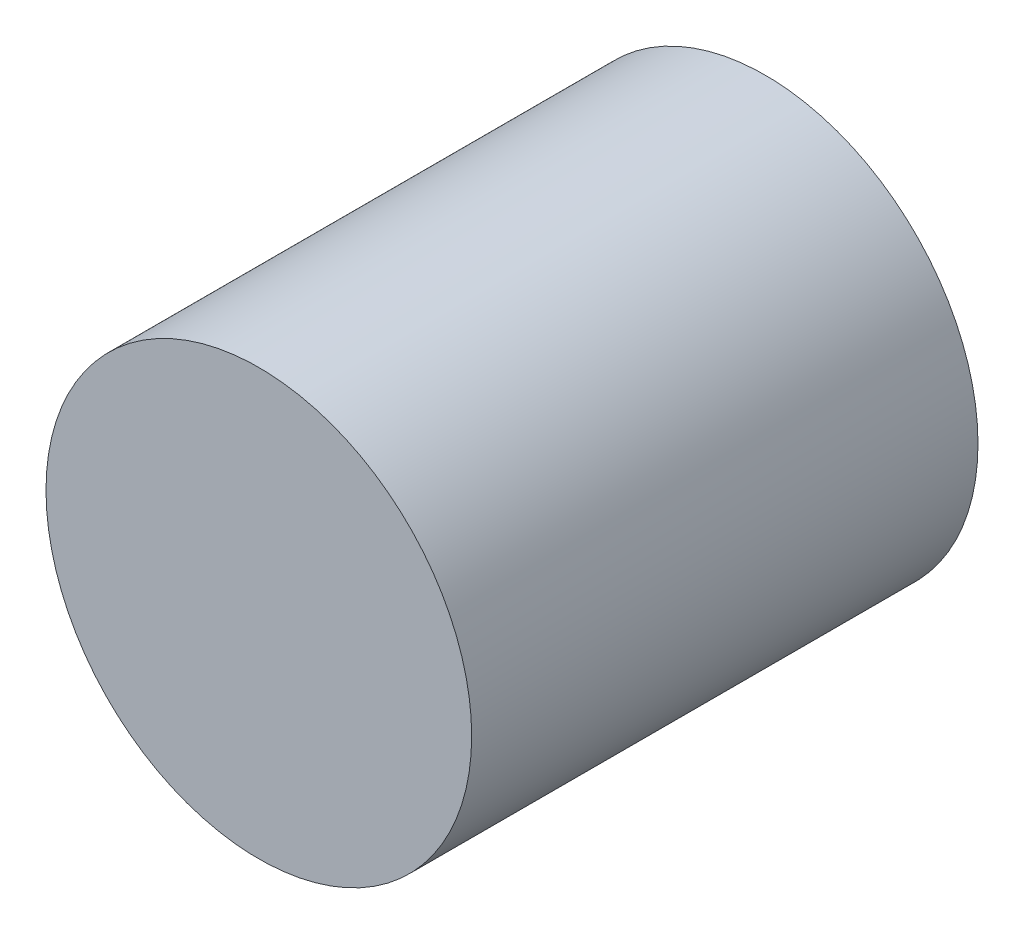
ISO-10303-21;
HEADER;
FILE_DESCRIPTION(('STEP AP214'),'2;1');
FILE_NAME('part.step','',(''),(''),'','','');
FILE_SCHEMA(('AUTOMOTIVE_DESIGN { 1 0 10303 214 1 1 1 1 }'));
ENDSEC;
DATA;
#1=APPLICATION_CONTEXT('core data for automotive mechanical design processes');
#2=APPLICATION_PROTOCOL_DEFINITION('international standard','automotive_design',2000,#1);
#3=PRODUCT_CONTEXT('',#1,'mechanical');
#4=PRODUCT('Part','Part','',(#3));
#5=PRODUCT_RELATED_PRODUCT_CATEGORY('part','',(#4));
#6=PRODUCT_DEFINITION_FORMATION('','',#4);
#7=PRODUCT_DEFINITION_CONTEXT('part definition',#1,'design');
#8=PRODUCT_DEFINITION('design','',#6,#7);
#9=PRODUCT_DEFINITION_SHAPE('','',#8);
#10=(LENGTH_UNIT() NAMED_UNIT(*) SI_UNIT(.MILLI.,.METRE.));
#11=(NAMED_UNIT(*) PLANE_ANGLE_UNIT() SI_UNIT($,.RADIAN.));
#12=(NAMED_UNIT(*) SI_UNIT($,.STERADIAN.) SOLID_ANGLE_UNIT());
#13=UNCERTAINTY_MEASURE_WITH_UNIT(LENGTH_MEASURE(1.E-05),#10,'distance_accuracy_value','');
#14=(GEOMETRIC_REPRESENTATION_CONTEXT(3) GLOBAL_UNCERTAINTY_ASSIGNED_CONTEXT((#13)) GLOBAL_UNIT_ASSIGNED_CONTEXT((#10,
#11,#12)) REPRESENTATION_CONTEXT('',''));
#15=CARTESIAN_POINT('',(0.,0.,0.));
#16=DIRECTION('',(0.,0.,1.));
#17=DIRECTION('',(1.,0.,0.));
#18=AXIS2_PLACEMENT_3D('',#15,#16,#17);
#19=CARTESIAN_POINT('',(0.,0.,13.56));
#20=DIRECTION('',(0.,0.,-1.));
#21=DIRECTION('',(-1.,0.,0.));
#22=AXIS2_PLACEMENT_3D('',#19,#20,#21);
#23=CYLINDRICAL_SURFACE('',#22,5.7);
#24=CARTESIAN_POINT('',(0.,0.,13.56));
#25=DIRECTION('',(0.,0.,1.));
#26=DIRECTION('',(1.,0.,0.));
#27=AXIS2_PLACEMENT_3D('',#24,#25,#26);
#28=CIRCLE('',#27,5.7);
#29=CARTESIAN_POINT('',(5.7,0.,13.56));
#30=VERTEX_POINT('',#29);
#31=EDGE_CURVE('E10',#30,#30,#28,.T.);
#32=ORIENTED_EDGE('',*,*,#31,.F.);
#33=EDGE_LOOP('',(#32));
#34=FACE_BOUND('',#33,.T.);
#35=CARTESIAN_POINT('',(0.,0.,0.));
#36=DIRECTION('',(0.,0.,1.));
#37=DIRECTION('',(1.,0.,0.));
#38=AXIS2_PLACEMENT_3D('',#35,#36,#37);
#39=CIRCLE('',#38,5.7);
#40=CARTESIAN_POINT('',(5.7,0.,0.));
#41=VERTEX_POINT('',#40);
#42=EDGE_CURVE('E44',#41,#41,#39,.T.);
#43=ORIENTED_EDGE('',*,*,#42,.T.);
#44=EDGE_LOOP('',(#43));
#45=FACE_BOUND('',#44,.T.);
#46=ADVANCED_FACE('F45',(#34,#45),#23,.T.);
#47=CARTESIAN_POINT('',(0.,0.,13.56));
#48=DIRECTION('',(0.,0.,1.));
#49=DIRECTION('',(1.,0.,0.));
#50=AXIS2_PLACEMENT_3D('',#47,#48,#49);
#51=PLANE('',#50);
#52=ORIENTED_EDGE('',*,*,#31,.T.);
#53=EDGE_LOOP('',(#52));
#54=FACE_BOUND('',#53,.T.);
#55=ADVANCED_FACE('F56',(#54),#51,.T.);
#56=CARTESIAN_POINT('',(0.,0.,0.));
#57=DIRECTION('',(0.,0.,1.));
#58=DIRECTION('',(1.,0.,0.));
#59=AXIS2_PLACEMENT_3D('',#56,#57,#58);
#60=PLANE('',#59);
#61=ORIENTED_EDGE('',*,*,#42,.F.);
#62=EDGE_LOOP('',(#61));
#63=FACE_BOUND('',#62,.T.);
#64=ADVANCED_FACE('F60',(#63),#60,.F.);
#65=CLOSED_SHELL('',(#46,#55,#64));
#66=MANIFOLD_SOLID_BREP('B2',#65);
#67=ADVANCED_BREP_SHAPE_REPRESENTATION('',(#18,#66),#14);
#68=SHAPE_DEFINITION_REPRESENTATION(#9,#67);
ENDSEC;
END-ISO-10303-21;
